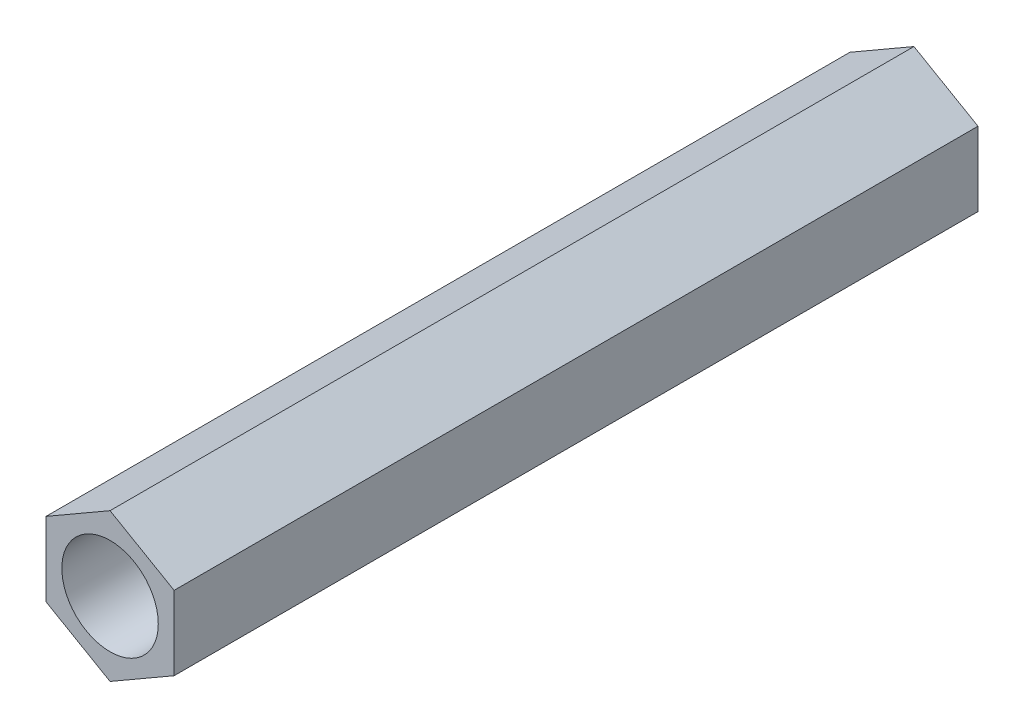
ISO-10303-21;
HEADER;
FILE_DESCRIPTION(('STEP AP214'),'2;1');
FILE_NAME('part.step','',(''),(''),'','','');
FILE_SCHEMA(('AUTOMOTIVE_DESIGN { 1 0 10303 214 1 1 1 1 }'));
ENDSEC;
DATA;
#1=APPLICATION_CONTEXT('core data for automotive mechanical design processes');
#2=APPLICATION_PROTOCOL_DEFINITION('international standard','automotive_design',2000,#1);
#3=PRODUCT_CONTEXT('',#1,'mechanical');
#4=PRODUCT('Part','Part','',(#3));
#5=PRODUCT_RELATED_PRODUCT_CATEGORY('part','',(#4));
#6=PRODUCT_DEFINITION_FORMATION('','',#4);
#7=PRODUCT_DEFINITION_CONTEXT('part definition',#1,'design');
#8=PRODUCT_DEFINITION('design','',#6,#7);
#9=PRODUCT_DEFINITION_SHAPE('','',#8);
#10=(LENGTH_UNIT() NAMED_UNIT(*) SI_UNIT(.MILLI.,.METRE.));
#11=(NAMED_UNIT(*) PLANE_ANGLE_UNIT() SI_UNIT($,.RADIAN.));
#12=(NAMED_UNIT(*) SI_UNIT($,.STERADIAN.) SOLID_ANGLE_UNIT());
#13=UNCERTAINTY_MEASURE_WITH_UNIT(LENGTH_MEASURE(1.E-05),#10,'distance_accuracy_value','');
#14=(GEOMETRIC_REPRESENTATION_CONTEXT(3) GLOBAL_UNCERTAINTY_ASSIGNED_CONTEXT((#13)) GLOBAL_UNIT_ASSIGNED_CONTEXT((#10,
#11,#12)) REPRESENTATION_CONTEXT('',''));
#15=CARTESIAN_POINT('',(0.,0.,0.));
#16=DIRECTION('',(0.,0.,1.));
#17=DIRECTION('',(1.,0.,0.));
#18=AXIS2_PLACEMENT_3D('',#15,#16,#17);
#19=CARTESIAN_POINT('',(0.,0.,25.));
#20=DIRECTION('',(0.,0.,1.));
#21=DIRECTION('',(1.,0.,0.));
#22=AXIS2_PLACEMENT_3D('',#19,#20,#21);
#23=PLANE('',#22);
#24=DIRECTION('',(-0.866025403784439,0.5,0.));
#25=VECTOR('',#24,1.);
#26=CARTESIAN_POINT('',(1.99185842870421,1.15,25.));
#27=LINE('',#26,#25);
#28=CARTESIAN_POINT('',(1.99185842870421,1.15,25.));
#29=VERTEX_POINT('',#28);
#30=CARTESIAN_POINT('',(0.,2.3,25.));
#31=VERTEX_POINT('',#30);
#32=EDGE_CURVE('E137',#29,#31,#27,.T.);
#33=ORIENTED_EDGE('',*,*,#32,.T.);
#34=DIRECTION('',(-0.866025403784439,-0.5,0.));
#35=VECTOR('',#34,1.);
#36=CARTESIAN_POINT('',(0.,2.3,25.));
#37=LINE('',#36,#35);
#38=CARTESIAN_POINT('',(-1.99185842870421,1.15,25.));
#39=VERTEX_POINT('',#38);
#40=EDGE_CURVE('E95',#31,#39,#37,.T.);
#41=ORIENTED_EDGE('',*,*,#40,.T.);
#42=DIRECTION('',(0.,-1.,0.));
#43=VECTOR('',#42,1.);
#44=CARTESIAN_POINT('',(-1.99185842870421,1.15,25.));
#45=LINE('',#44,#43);
#46=CARTESIAN_POINT('',(-1.99185842870421,-1.15,25.));
#47=VERTEX_POINT('',#46);
#48=EDGE_CURVE('E108',#39,#47,#45,.T.);
#49=ORIENTED_EDGE('',*,*,#48,.T.);
#50=DIRECTION('',(0.866025403784439,-0.5,0.));
#51=VECTOR('',#50,1.);
#52=CARTESIAN_POINT('',(-1.99185842870421,-1.15,25.));
#53=LINE('',#52,#51);
#54=CARTESIAN_POINT('',(0.,-2.3,25.));
#55=VERTEX_POINT('',#54);
#56=EDGE_CURVE('E102',#47,#55,#53,.T.);
#57=ORIENTED_EDGE('',*,*,#56,.T.);
#58=DIRECTION('',(0.866025403784439,0.5,0.));
#59=VECTOR('',#58,1.);
#60=CARTESIAN_POINT('',(0.,-2.3,25.));
#61=LINE('',#60,#59);
#62=CARTESIAN_POINT('',(1.99185842870421,-1.15,25.));
#63=VERTEX_POINT('',#62);
#64=EDGE_CURVE('E106',#55,#63,#61,.T.);
#65=ORIENTED_EDGE('',*,*,#64,.T.);
#66=DIRECTION('',(0.,1.,0.));
#67=VECTOR('',#66,1.);
#68=CARTESIAN_POINT('',(1.99185842870421,-1.15,25.));
#69=LINE('',#68,#67);
#70=EDGE_CURVE('E58',#63,#29,#69,.T.);
#71=ORIENTED_EDGE('',*,*,#70,.T.);
#72=EDGE_LOOP('',(#33,#41,#49,#57,#65,#71));
#73=FACE_BOUND('',#72,.T.);
#74=CARTESIAN_POINT('',(0.,0.,25.));
#75=DIRECTION('',(0.,0.,1.));
#76=DIRECTION('',(1.,0.,0.));
#77=AXIS2_PLACEMENT_3D('',#74,#75,#76);
#78=CIRCLE('',#77,1.5);
#79=CARTESIAN_POINT('',(1.5,0.,25.));
#80=VERTEX_POINT('',#79);
#81=EDGE_CURVE('E130',#80,#80,#78,.T.);
#82=ORIENTED_EDGE('',*,*,#81,.F.);
#83=EDGE_LOOP('',(#82));
#84=FACE_BOUND('',#83,.T.);
#85=ADVANCED_FACE('F41',(#73,#84),#23,.T.);
#86=CARTESIAN_POINT('',(0.,0.,0.));
#87=DIRECTION('',(0.,0.,1.));
#88=DIRECTION('',(1.,0.,0.));
#89=AXIS2_PLACEMENT_3D('',#86,#87,#88);
#90=PLANE('',#89);
#91=DIRECTION('',(-0.866025403784439,0.5,0.));
#92=VECTOR('',#91,1.);
#93=CARTESIAN_POINT('',(1.99185842870421,1.15,0.));
#94=LINE('',#93,#92);
#95=CARTESIAN_POINT('',(1.99185842870421,1.15,0.));
#96=VERTEX_POINT('',#95);
#97=CARTESIAN_POINT('',(0.,2.3,0.));
#98=VERTEX_POINT('',#97);
#99=EDGE_CURVE('E126',#96,#98,#94,.T.);
#100=ORIENTED_EDGE('',*,*,#99,.F.);
#101=DIRECTION('',(0.,1.,0.));
#102=VECTOR('',#101,1.);
#103=CARTESIAN_POINT('',(1.99185842870421,-1.15,0.));
#104=LINE('',#103,#102);
#105=CARTESIAN_POINT('',(1.99185842870421,-1.15,0.));
#106=VERTEX_POINT('',#105);
#107=EDGE_CURVE('E87',#106,#96,#104,.T.);
#108=ORIENTED_EDGE('',*,*,#107,.F.);
#109=DIRECTION('',(0.866025403784439,0.5,0.));
#110=VECTOR('',#109,1.);
#111=CARTESIAN_POINT('',(0.,-2.3,0.));
#112=LINE('',#111,#110);
#113=CARTESIAN_POINT('',(0.,-2.3,0.));
#114=VERTEX_POINT('',#113);
#115=EDGE_CURVE('E81',#114,#106,#112,.T.);
#116=ORIENTED_EDGE('',*,*,#115,.F.);
#117=DIRECTION('',(0.866025403784439,-0.5,0.));
#118=VECTOR('',#117,1.);
#119=CARTESIAN_POINT('',(-1.99185842870421,-1.15,0.));
#120=LINE('',#119,#118);
#121=CARTESIAN_POINT('',(-1.99185842870421,-1.15,0.));
#122=VERTEX_POINT('',#121);
#123=EDGE_CURVE('E116',#122,#114,#120,.T.);
#124=ORIENTED_EDGE('',*,*,#123,.F.);
#125=DIRECTION('',(0.,-1.,0.));
#126=VECTOR('',#125,1.);
#127=CARTESIAN_POINT('',(-1.99185842870421,1.15,0.));
#128=LINE('',#127,#126);
#129=CARTESIAN_POINT('',(-1.99185842870421,1.15,0.));
#130=VERTEX_POINT('',#129);
#131=EDGE_CURVE('E132',#130,#122,#128,.T.);
#132=ORIENTED_EDGE('',*,*,#131,.F.);
#133=DIRECTION('',(-0.866025403784439,-0.5,0.));
#134=VECTOR('',#133,1.);
#135=CARTESIAN_POINT('',(0.,2.3,0.));
#136=LINE('',#135,#134);
#137=EDGE_CURVE('E129',#98,#130,#136,.T.);
#138=ORIENTED_EDGE('',*,*,#137,.F.);
#139=EDGE_LOOP('',(#100,#108,#116,#124,#132,#138));
#140=FACE_BOUND('',#139,.T.);
#141=CARTESIAN_POINT('',(0.,0.,0.));
#142=DIRECTION('',(0.,0.,1.));
#143=DIRECTION('',(1.,0.,0.));
#144=AXIS2_PLACEMENT_3D('',#141,#142,#143);
#145=CIRCLE('',#144,1.5);
#146=CARTESIAN_POINT('',(1.5,0.,0.));
#147=VERTEX_POINT('',#146);
#148=EDGE_CURVE('E230',#147,#147,#145,.T.);
#149=ORIENTED_EDGE('',*,*,#148,.T.);
#150=EDGE_LOOP('',(#149));
#151=FACE_BOUND('',#150,.T.);
#152=ADVANCED_FACE('F146',(#140,#151),#90,.F.);
#153=CARTESIAN_POINT('',(1.99185842870421,1.15,25.));
#154=DIRECTION('',(-0.5,-0.866025403784439,0.));
#155=DIRECTION('',(0.866025403784439,-0.5,0.));
#156=AXIS2_PLACEMENT_3D('',#153,#154,#155);
#157=PLANE('',#156);
#158=ORIENTED_EDGE('',*,*,#99,.T.);
#159=DIRECTION('',(0.,0.,-1.));
#160=VECTOR('',#159,1.);
#161=CARTESIAN_POINT('',(0.,2.3,25.));
#162=LINE('',#161,#160);
#163=EDGE_CURVE('E11',#31,#98,#162,.T.);
#164=ORIENTED_EDGE('',*,*,#163,.F.);
#165=ORIENTED_EDGE('',*,*,#32,.F.);
#166=DIRECTION('',(0.,0.,-1.));
#167=VECTOR('',#166,1.);
#168=CARTESIAN_POINT('',(1.99185842870421,1.15,25.));
#169=LINE('',#168,#167);
#170=EDGE_CURVE('E122',#29,#96,#169,.T.);
#171=ORIENTED_EDGE('',*,*,#170,.T.);
#172=EDGE_LOOP('',(#158,#164,#165,#171));
#173=FACE_BOUND('',#172,.T.);
#174=ADVANCED_FACE('F43',(#173),#157,.F.);
#175=CARTESIAN_POINT('',(0.,2.3,25.));
#176=DIRECTION('',(0.5,-0.866025403784439,0.));
#177=DIRECTION('',(0.866025403784439,0.5,0.));
#178=AXIS2_PLACEMENT_3D('',#175,#176,#177);
#179=PLANE('',#178);
#180=ORIENTED_EDGE('',*,*,#137,.T.);
#181=DIRECTION('',(0.,0.,-1.));
#182=VECTOR('',#181,1.);
#183=CARTESIAN_POINT('',(-1.99185842870421,1.15,25.));
#184=LINE('',#183,#182);
#185=EDGE_CURVE('E50',#39,#130,#184,.T.);
#186=ORIENTED_EDGE('',*,*,#185,.F.);
#187=ORIENTED_EDGE('',*,*,#40,.F.);
#188=ORIENTED_EDGE('',*,*,#163,.T.);
#189=EDGE_LOOP('',(#180,#186,#187,#188));
#190=FACE_BOUND('',#189,.T.);
#191=ADVANCED_FACE('F171',(#190),#179,.F.);
#192=CARTESIAN_POINT('',(-1.99185842870421,1.15,25.));
#193=DIRECTION('',(1.,0.,0.));
#194=DIRECTION('',(0.,1.,0.));
#195=AXIS2_PLACEMENT_3D('',#192,#193,#194);
#196=PLANE('',#195);
#197=ORIENTED_EDGE('',*,*,#131,.T.);
#198=DIRECTION('',(0.,0.,-1.));
#199=VECTOR('',#198,1.);
#200=CARTESIAN_POINT('',(-1.99185842870421,-1.15,25.));
#201=LINE('',#200,#199);
#202=EDGE_CURVE('E117',#47,#122,#201,.T.);
#203=ORIENTED_EDGE('',*,*,#202,.F.);
#204=ORIENTED_EDGE('',*,*,#48,.F.);
#205=ORIENTED_EDGE('',*,*,#185,.T.);
#206=EDGE_LOOP('',(#197,#203,#204,#205));
#207=FACE_BOUND('',#206,.T.);
#208=ADVANCED_FACE('F143',(#207),#196,.F.);
#209=CARTESIAN_POINT('',(-1.99185842870421,-1.15,25.));
#210=DIRECTION('',(0.5,0.866025403784439,0.));
#211=DIRECTION('',(-0.866025403784439,0.5,0.));
#212=AXIS2_PLACEMENT_3D('',#209,#210,#211);
#213=PLANE('',#212);
#214=ORIENTED_EDGE('',*,*,#123,.T.);
#215=DIRECTION('',(0.,0.,-1.));
#216=VECTOR('',#215,1.);
#217=CARTESIAN_POINT('',(0.,-2.3,25.));
#218=LINE('',#217,#216);
#219=EDGE_CURVE('E113',#55,#114,#218,.T.);
#220=ORIENTED_EDGE('',*,*,#219,.F.);
#221=ORIENTED_EDGE('',*,*,#56,.F.);
#222=ORIENTED_EDGE('',*,*,#202,.T.);
#223=EDGE_LOOP('',(#214,#220,#221,#222));
#224=FACE_BOUND('',#223,.T.);
#225=ADVANCED_FACE('F114',(#224),#213,.F.);
#226=CARTESIAN_POINT('',(0.,-2.3,25.));
#227=DIRECTION('',(-0.5,0.866025403784439,0.));
#228=DIRECTION('',(-0.866025403784439,-0.5,0.));
#229=AXIS2_PLACEMENT_3D('',#226,#227,#228);
#230=PLANE('',#229);
#231=ORIENTED_EDGE('',*,*,#115,.T.);
#232=DIRECTION('',(0.,0.,-1.));
#233=VECTOR('',#232,1.);
#234=CARTESIAN_POINT('',(1.99185842870421,-1.15,25.));
#235=LINE('',#234,#233);
#236=EDGE_CURVE('E118',#63,#106,#235,.T.);
#237=ORIENTED_EDGE('',*,*,#236,.F.);
#238=ORIENTED_EDGE('',*,*,#64,.F.);
#239=ORIENTED_EDGE('',*,*,#219,.T.);
#240=EDGE_LOOP('',(#231,#237,#238,#239));
#241=FACE_BOUND('',#240,.T.);
#242=ADVANCED_FACE('F120',(#241),#230,.F.);
#243=CARTESIAN_POINT('',(1.99185842870421,-1.15,25.));
#244=DIRECTION('',(-1.,0.,0.));
#245=DIRECTION('',(0.,-1.,0.));
#246=AXIS2_PLACEMENT_3D('',#243,#244,#245);
#247=PLANE('',#246);
#248=ORIENTED_EDGE('',*,*,#107,.T.);
#249=ORIENTED_EDGE('',*,*,#170,.F.);
#250=ORIENTED_EDGE('',*,*,#70,.F.);
#251=ORIENTED_EDGE('',*,*,#236,.T.);
#252=EDGE_LOOP('',(#248,#249,#250,#251));
#253=FACE_BOUND('',#252,.T.);
#254=ADVANCED_FACE('F151',(#253),#247,.F.);
#255=CARTESIAN_POINT('',(0.,0.,25.));
#256=DIRECTION('',(0.,0.,-1.));
#257=DIRECTION('',(-1.,0.,0.));
#258=AXIS2_PLACEMENT_3D('',#255,#256,#257);
#259=CYLINDRICAL_SURFACE('',#258,1.5);
#260=ORIENTED_EDGE('',*,*,#81,.T.);
#261=EDGE_LOOP('',(#260));
#262=FACE_BOUND('',#261,.T.);
#263=ORIENTED_EDGE('',*,*,#148,.F.);
#264=EDGE_LOOP('',(#263));
#265=FACE_BOUND('',#264,.T.);
#266=ADVANCED_FACE('F153',(#262,#265),#259,.F.);
#267=CLOSED_SHELL('',(#85,#152,#174,#191,#208,#225,#242,#254,#266));
#268=MANIFOLD_SOLID_BREP('B2',#267);
#269=ADVANCED_BREP_SHAPE_REPRESENTATION('',(#18,#268),#14);
#270=SHAPE_DEFINITION_REPRESENTATION(#9,#269);
ENDSEC;
END-ISO-10303-21;
